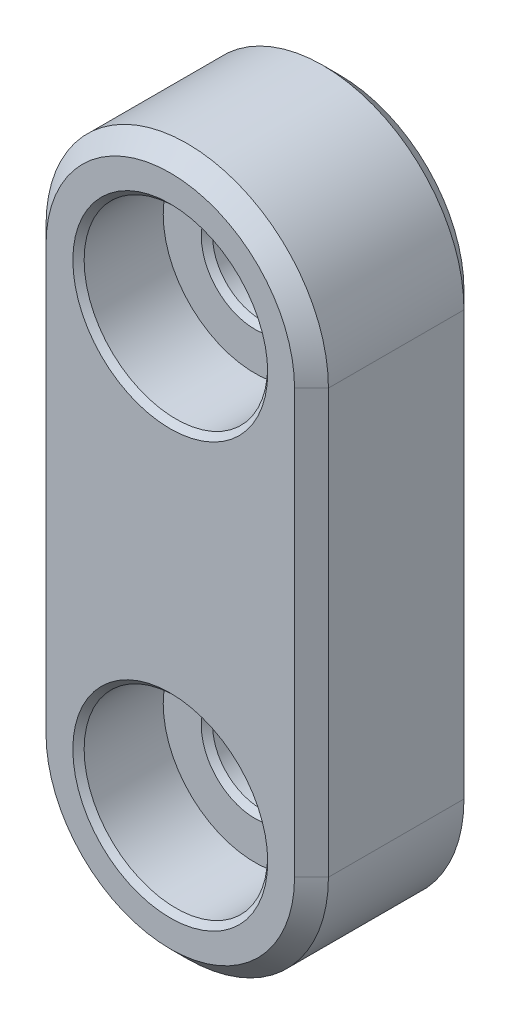
ISO-10303-21;
HEADER;
FILE_DESCRIPTION(('STEP AP214'),'2;1');
FILE_NAME('part.step','',(''),(''),'','','');
FILE_SCHEMA(('AUTOMOTIVE_DESIGN { 1 0 10303 214 1 1 1 1 }'));
ENDSEC;
DATA;
#1=APPLICATION_CONTEXT('core data for automotive mechanical design processes');
#2=APPLICATION_PROTOCOL_DEFINITION('international standard','automotive_design',2000,#1);
#3=PRODUCT_CONTEXT('',#1,'mechanical');
#4=PRODUCT('Part','Part','',(#3));
#5=PRODUCT_RELATED_PRODUCT_CATEGORY('part','',(#4));
#6=PRODUCT_DEFINITION_FORMATION('','',#4);
#7=PRODUCT_DEFINITION_CONTEXT('part definition',#1,'design');
#8=PRODUCT_DEFINITION('design','',#6,#7);
#9=PRODUCT_DEFINITION_SHAPE('','',#8);
#10=(LENGTH_UNIT() NAMED_UNIT(*) SI_UNIT(.MILLI.,.METRE.));
#11=(NAMED_UNIT(*) PLANE_ANGLE_UNIT() SI_UNIT($,.RADIAN.));
#12=(NAMED_UNIT(*) SI_UNIT($,.STERADIAN.) SOLID_ANGLE_UNIT());
#13=UNCERTAINTY_MEASURE_WITH_UNIT(LENGTH_MEASURE(1.E-05),#10,'distance_accuracy_value','');
#14=(GEOMETRIC_REPRESENTATION_CONTEXT(3) GLOBAL_UNCERTAINTY_ASSIGNED_CONTEXT((#13)) GLOBAL_UNIT_ASSIGNED_CONTEXT((#10,
#11,#12)) REPRESENTATION_CONTEXT('',''));
#15=CARTESIAN_POINT('',(0.,0.,0.));
#16=DIRECTION('',(0.,0.,1.));
#17=DIRECTION('',(1.,0.,0.));
#18=AXIS2_PLACEMENT_3D('',#15,#16,#17);
#19=CARTESIAN_POINT('',(0.,-7.5,6.));
#20=DIRECTION('',(0.,0.,-1.));
#21=DIRECTION('',(-1.,0.,0.));
#22=AXIS2_PLACEMENT_3D('',#19,#20,#21);
#23=CYLINDRICAL_SURFACE('',#22,5.);
#24=DIRECTION('',(0.,0.,-1.));
#25=VECTOR('',#24,1.);
#26=CARTESIAN_POINT('',(5.,-7.5,6.));
#27=LINE('',#26,#25);
#28=CARTESIAN_POINT('',(5.,-7.5,5.4));
#29=VERTEX_POINT('',#28);
#30=CARTESIAN_POINT('',(5.,-7.5,0.599999999999996));
#31=VERTEX_POINT('',#30);
#32=EDGE_CURVE('E128',#29,#31,#27,.T.);
#33=ORIENTED_EDGE('',*,*,#32,.F.);
#34=CARTESIAN_POINT('',(0.,-7.5,5.4));
#35=DIRECTION('',(0.,0.,1.));
#36=DIRECTION('',(1.,0.,0.));
#37=AXIS2_PLACEMENT_3D('',#34,#35,#36);
#38=CIRCLE('',#37,5.);
#39=CARTESIAN_POINT('',(-5.,-7.5,5.4));
#40=VERTEX_POINT('',#39);
#41=EDGE_CURVE('E220',#29,#40,#38,.F.);
#42=ORIENTED_EDGE('',*,*,#41,.T.);
#43=DIRECTION('',(0.,0.,-1.));
#44=VECTOR('',#43,1.);
#45=CARTESIAN_POINT('',(-5.,-7.5,6.));
#46=LINE('',#45,#44);
#47=CARTESIAN_POINT('',(-5.,-7.5,0.599999999999996));
#48=VERTEX_POINT('',#47);
#49=EDGE_CURVE('E134',#40,#48,#46,.T.);
#50=ORIENTED_EDGE('',*,*,#49,.T.);
#51=CARTESIAN_POINT('',(0.,-7.5,0.599999999999996));
#52=DIRECTION('',(0.,0.,1.));
#53=DIRECTION('',(1.,0.,0.));
#54=AXIS2_PLACEMENT_3D('',#51,#52,#53);
#55=CIRCLE('',#54,5.);
#56=EDGE_CURVE('E217',#48,#31,#55,.T.);
#57=ORIENTED_EDGE('',*,*,#56,.T.);
#58=EDGE_LOOP('',(#33,#42,#50,#57));
#59=FACE_BOUND('',#58,.T.);
#60=ADVANCED_FACE('F39',(#59),#23,.T.);
#61=CARTESIAN_POINT('',(5.,-7.5,6.));
#62=DIRECTION('',(-1.,0.,0.));
#63=DIRECTION('',(0.,-1.,0.));
#64=AXIS2_PLACEMENT_3D('',#61,#62,#63);
#65=PLANE('',#64);
#66=DIRECTION('',(0.,0.,-1.));
#67=VECTOR('',#66,1.);
#68=CARTESIAN_POINT('',(5.,7.5,6.));
#69=LINE('',#68,#67);
#70=CARTESIAN_POINT('',(5.,7.5,5.4));
#71=VERTEX_POINT('',#70);
#72=CARTESIAN_POINT('',(5.,7.5,0.599999999999996));
#73=VERTEX_POINT('',#72);
#74=EDGE_CURVE('E210',#71,#73,#69,.T.);
#75=ORIENTED_EDGE('',*,*,#74,.F.);
#76=DIRECTION('',(0.,-1.,0.));
#77=VECTOR('',#76,1.);
#78=CARTESIAN_POINT('',(5.,-7.5,5.4));
#79=LINE('',#78,#77);
#80=EDGE_CURVE('E131',#71,#29,#79,.T.);
#81=ORIENTED_EDGE('',*,*,#80,.T.);
#82=ORIENTED_EDGE('',*,*,#32,.T.);
#83=DIRECTION('',(0.,1.,0.));
#84=VECTOR('',#83,1.);
#85=CARTESIAN_POINT('',(5.,-7.5,0.599999999999996));
#86=LINE('',#85,#84);
#87=EDGE_CURVE('E223',#31,#73,#86,.T.);
#88=ORIENTED_EDGE('',*,*,#87,.T.);
#89=EDGE_LOOP('',(#75,#81,#82,#88));
#90=FACE_BOUND('',#89,.T.);
#91=ADVANCED_FACE('F259',(#90),#65,.F.);
#92=CARTESIAN_POINT('',(0.,7.5,6.));
#93=DIRECTION('',(0.,0.,-1.));
#94=DIRECTION('',(-1.,0.,0.));
#95=AXIS2_PLACEMENT_3D('',#92,#93,#94);
#96=CYLINDRICAL_SURFACE('',#95,5.);
#97=DIRECTION('',(0.,0.,-1.));
#98=VECTOR('',#97,1.);
#99=CARTESIAN_POINT('',(-5.,7.5,6.));
#100=LINE('',#99,#98);
#101=CARTESIAN_POINT('',(-5.,7.5,5.4));
#102=VERTEX_POINT('',#101);
#103=CARTESIAN_POINT('',(-5.,7.5,0.599999999999996));
#104=VERTEX_POINT('',#103);
#105=EDGE_CURVE('E207',#102,#104,#100,.T.);
#106=ORIENTED_EDGE('',*,*,#105,.F.);
#107=CARTESIAN_POINT('',(0.,7.5,5.4));
#108=DIRECTION('',(0.,0.,1.));
#109=DIRECTION('',(1.,0.,0.));
#110=AXIS2_PLACEMENT_3D('',#107,#108,#109);
#111=CIRCLE('',#110,5.);
#112=EDGE_CURVE('E232',#102,#71,#111,.F.);
#113=ORIENTED_EDGE('',*,*,#112,.T.);
#114=ORIENTED_EDGE('',*,*,#74,.T.);
#115=CARTESIAN_POINT('',(0.,7.5,0.599999999999996));
#116=DIRECTION('',(0.,0.,1.));
#117=DIRECTION('',(1.,0.,0.));
#118=AXIS2_PLACEMENT_3D('',#115,#116,#117);
#119=CIRCLE('',#118,5.);
#120=EDGE_CURVE('E230',#73,#104,#119,.T.);
#121=ORIENTED_EDGE('',*,*,#120,.T.);
#122=EDGE_LOOP('',(#106,#113,#114,#121));
#123=FACE_BOUND('',#122,.T.);
#124=ADVANCED_FACE('F262',(#123),#96,.T.);
#125=CARTESIAN_POINT('',(-5.,-7.5,6.));
#126=DIRECTION('',(1.,0.,0.));
#127=DIRECTION('',(0.,1.,0.));
#128=AXIS2_PLACEMENT_3D('',#125,#126,#127);
#129=PLANE('',#128);
#130=ORIENTED_EDGE('',*,*,#49,.F.);
#131=DIRECTION('',(0.,1.,0.));
#132=VECTOR('',#131,1.);
#133=CARTESIAN_POINT('',(-5.,7.5,5.4));
#134=LINE('',#133,#132);
#135=EDGE_CURVE('E228',#40,#102,#134,.T.);
#136=ORIENTED_EDGE('',*,*,#135,.T.);
#137=ORIENTED_EDGE('',*,*,#105,.T.);
#138=DIRECTION('',(0.,-1.,0.));
#139=VECTOR('',#138,1.);
#140=CARTESIAN_POINT('',(-5.,-7.5,0.599999999999996));
#141=LINE('',#140,#139);
#142=EDGE_CURVE('E226',#104,#48,#141,.T.);
#143=ORIENTED_EDGE('',*,*,#142,.T.);
#144=EDGE_LOOP('',(#130,#136,#137,#143));
#145=FACE_BOUND('',#144,.T.);
#146=ADVANCED_FACE('F248',(#145),#129,.F.);
#147=CARTESIAN_POINT('',(0.,-7.5,6.));
#148=DIRECTION('',(0.,0.,1.));
#149=DIRECTION('',(1.,0.,0.));
#150=AXIS2_PLACEMENT_3D('',#147,#148,#149);
#151=PLANE('',#150);
#152=CARTESIAN_POINT('',(0.,7.5,6.));
#153=DIRECTION('',(0.,0.,1.));
#154=DIRECTION('',(1.,0.,0.));
#155=AXIS2_PLACEMENT_3D('',#152,#153,#154);
#156=CIRCLE('',#155,3.44999999999999);
#157=CARTESIAN_POINT('',(3.44999999999999,7.5,6.));
#158=VERTEX_POINT('',#157);
#159=EDGE_CURVE('E48',#158,#158,#156,.F.);
#160=ORIENTED_EDGE('',*,*,#159,.T.);
#161=EDGE_LOOP('',(#160));
#162=FACE_BOUND('',#161,.T.);
#163=CARTESIAN_POINT('',(0.,-7.5,6.));
#164=DIRECTION('',(0.,0.,1.));
#165=DIRECTION('',(1.,0.,0.));
#166=AXIS2_PLACEMENT_3D('',#163,#164,#165);
#167=CIRCLE('',#166,3.44999999999999);
#168=CARTESIAN_POINT('',(3.44999999999999,-7.5,6.));
#169=VERTEX_POINT('',#168);
#170=EDGE_CURVE('E178',#169,#169,#167,.F.);
#171=ORIENTED_EDGE('',*,*,#170,.T.);
#172=EDGE_LOOP('',(#171));
#173=FACE_BOUND('',#172,.T.);
#174=DIRECTION('',(0.,-1.,0.));
#175=VECTOR('',#174,1.);
#176=CARTESIAN_POINT('',(-4.4,-7.5,6.));
#177=LINE('',#176,#175);
#178=CARTESIAN_POINT('',(-4.40000000000001,7.5,6.));
#179=VERTEX_POINT('',#178);
#180=CARTESIAN_POINT('',(-4.4,-7.5,6.));
#181=VERTEX_POINT('',#180);
#182=EDGE_CURVE('E117',#179,#181,#177,.T.);
#183=ORIENTED_EDGE('',*,*,#182,.T.);
#184=CARTESIAN_POINT('',(0.,-7.5,6.));
#185=DIRECTION('',(0.,0.,1.));
#186=DIRECTION('',(1.,0.,0.));
#187=AXIS2_PLACEMENT_3D('',#184,#185,#186);
#188=CIRCLE('',#187,4.4);
#189=CARTESIAN_POINT('',(4.4,-7.5,6.));
#190=VERTEX_POINT('',#189);
#191=EDGE_CURVE('E113',#181,#190,#188,.T.);
#192=ORIENTED_EDGE('',*,*,#191,.T.);
#193=DIRECTION('',(0.,1.,0.));
#194=VECTOR('',#193,1.);
#195=CARTESIAN_POINT('',(4.4,7.5,6.));
#196=LINE('',#195,#194);
#197=CARTESIAN_POINT('',(4.4,7.5,6.));
#198=VERTEX_POINT('',#197);
#199=EDGE_CURVE('E107',#190,#198,#196,.T.);
#200=ORIENTED_EDGE('',*,*,#199,.T.);
#201=CARTESIAN_POINT('',(0.,7.5,6.));
#202=DIRECTION('',(0.,0.,1.));
#203=DIRECTION('',(1.,0.,0.));
#204=AXIS2_PLACEMENT_3D('',#201,#202,#203);
#205=CIRCLE('',#204,4.4);
#206=EDGE_CURVE('E110',#198,#179,#205,.T.);
#207=ORIENTED_EDGE('',*,*,#206,.T.);
#208=EDGE_LOOP('',(#183,#192,#200,#207));
#209=FACE_BOUND('',#208,.T.);
#210=ADVANCED_FACE('F109',(#162,#173,#209),#151,.T.);
#211=CARTESIAN_POINT('',(0.,-7.5,0.));
#212=DIRECTION('',(0.,0.,1.));
#213=DIRECTION('',(1.,0.,0.));
#214=AXIS2_PLACEMENT_3D('',#211,#212,#213);
#215=PLANE('',#214);
#216=CARTESIAN_POINT('',(0.,-7.5,0.));
#217=DIRECTION('',(0.,0.,1.));
#218=DIRECTION('',(1.,0.,0.));
#219=AXIS2_PLACEMENT_3D('',#216,#217,#218);
#220=CIRCLE('',#219,1.9);
#221=CARTESIAN_POINT('',(1.9,-7.5,0.));
#222=VERTEX_POINT('',#221);
#223=EDGE_CURVE('E163',#222,#222,#220,.T.);
#224=ORIENTED_EDGE('',*,*,#223,.T.);
#225=EDGE_LOOP('',(#224));
#226=FACE_BOUND('',#225,.T.);
#227=CARTESIAN_POINT('',(0.,7.5,0.));
#228=DIRECTION('',(0.,0.,1.));
#229=DIRECTION('',(1.,0.,0.));
#230=AXIS2_PLACEMENT_3D('',#227,#228,#229);
#231=CIRCLE('',#230,1.9);
#232=CARTESIAN_POINT('',(1.89999999999999,7.5,0.));
#233=VERTEX_POINT('',#232);
#234=EDGE_CURVE('E160',#233,#233,#231,.T.);
#235=ORIENTED_EDGE('',*,*,#234,.T.);
#236=EDGE_LOOP('',(#235));
#237=FACE_BOUND('',#236,.T.);
#238=DIRECTION('',(0.,-1.,0.));
#239=VECTOR('',#238,1.);
#240=CARTESIAN_POINT('',(4.4,-7.5,0.));
#241=LINE('',#240,#239);
#242=CARTESIAN_POINT('',(4.4,7.5,0.));
#243=VERTEX_POINT('',#242);
#244=CARTESIAN_POINT('',(4.4,-7.5,0.));
#245=VERTEX_POINT('',#244);
#246=EDGE_CURVE('E55',#243,#245,#241,.T.);
#247=ORIENTED_EDGE('',*,*,#246,.T.);
#248=CARTESIAN_POINT('',(0.,-7.5,0.));
#249=DIRECTION('',(0.,0.,1.));
#250=DIRECTION('',(1.,0.,0.));
#251=AXIS2_PLACEMENT_3D('',#248,#249,#250);
#252=CIRCLE('',#251,4.4);
#253=CARTESIAN_POINT('',(-4.4,-7.5,0.));
#254=VERTEX_POINT('',#253);
#255=EDGE_CURVE('E154',#245,#254,#252,.F.);
#256=ORIENTED_EDGE('',*,*,#255,.T.);
#257=DIRECTION('',(0.,1.,0.));
#258=VECTOR('',#257,1.);
#259=CARTESIAN_POINT('',(-4.4,-7.5,0.));
#260=LINE('',#259,#258);
#261=CARTESIAN_POINT('',(-4.4,7.5,0.));
#262=VERTEX_POINT('',#261);
#263=EDGE_CURVE('E236',#254,#262,#260,.T.);
#264=ORIENTED_EDGE('',*,*,#263,.T.);
#265=CARTESIAN_POINT('',(0.,7.5,0.));
#266=DIRECTION('',(0.,0.,1.));
#267=DIRECTION('',(1.,0.,0.));
#268=AXIS2_PLACEMENT_3D('',#265,#266,#267);
#269=CIRCLE('',#268,4.4);
#270=EDGE_CURVE('E234',#262,#243,#269,.F.);
#271=ORIENTED_EDGE('',*,*,#270,.T.);
#272=EDGE_LOOP('',(#247,#256,#264,#271));
#273=FACE_BOUND('',#272,.T.);
#274=ADVANCED_FACE('F309',(#226,#237,#273),#215,.F.);
#275=CARTESIAN_POINT('',(0.,7.5,6.));
#276=DIRECTION('',(0.,0.,-1.));
#277=DIRECTION('',(-1.,0.,0.));
#278=AXIS2_PLACEMENT_3D('',#275,#276,#277);
#279=CONICAL_SURFACE('',#278,4.4,0.785398163397449);
#280=DIRECTION('',(-0.707106781186548,0.,0.707106781186547));
#281=VECTOR('',#280,1.);
#282=CARTESIAN_POINT('',(5.,7.5,5.4));
#283=LINE('',#282,#281);
#284=EDGE_CURVE('E123',#71,#198,#283,.T.);
#285=ORIENTED_EDGE('',*,*,#284,.F.);
#286=ORIENTED_EDGE('',*,*,#112,.F.);
#287=DIRECTION('',(-0.707106781186548,0.,-0.707106781186547));
#288=VECTOR('',#287,1.);
#289=CARTESIAN_POINT('',(-4.40000000000001,7.5,6.));
#290=LINE('',#289,#288);
#291=EDGE_CURVE('E126',#179,#102,#290,.T.);
#292=ORIENTED_EDGE('',*,*,#291,.F.);
#293=ORIENTED_EDGE('',*,*,#206,.F.);
#294=EDGE_LOOP('',(#285,#286,#292,#293));
#295=FACE_BOUND('',#294,.T.);
#296=ADVANCED_FACE('F121',(#295),#279,.T.);
#297=CARTESIAN_POINT('',(-4.4,-7.5,6.));
#298=DIRECTION('',(-0.707106781186547,0.,0.707106781186548));
#299=DIRECTION('',(0.,1.,0.));
#300=AXIS2_PLACEMENT_3D('',#297,#298,#299);
#301=PLANE('',#300);
#302=ORIENTED_EDGE('',*,*,#291,.T.);
#303=ORIENTED_EDGE('',*,*,#135,.F.);
#304=DIRECTION('',(-0.707106781186548,0.,-0.707106781186547));
#305=VECTOR('',#304,1.);
#306=CARTESIAN_POINT('',(-4.4,-7.5,6.));
#307=LINE('',#306,#305);
#308=EDGE_CURVE('E132',#181,#40,#307,.T.);
#309=ORIENTED_EDGE('',*,*,#308,.F.);
#310=ORIENTED_EDGE('',*,*,#182,.F.);
#311=EDGE_LOOP('',(#302,#303,#309,#310));
#312=FACE_BOUND('',#311,.T.);
#313=ADVANCED_FACE('F299',(#312),#301,.T.);
#314=CARTESIAN_POINT('',(4.4,-7.5,6.));
#315=DIRECTION('',(0.707106781186547,0.,0.707106781186548));
#316=DIRECTION('',(0.,-1.,0.));
#317=AXIS2_PLACEMENT_3D('',#314,#315,#316);
#318=PLANE('',#317);
#319=ORIENTED_EDGE('',*,*,#284,.T.);
#320=ORIENTED_EDGE('',*,*,#199,.F.);
#321=DIRECTION('',(-0.707106781186548,0.,0.707106781186547));
#322=VECTOR('',#321,1.);
#323=CARTESIAN_POINT('',(5.,-7.5,5.4));
#324=LINE('',#323,#322);
#325=EDGE_CURVE('E136',#29,#190,#324,.T.);
#326=ORIENTED_EDGE('',*,*,#325,.F.);
#327=ORIENTED_EDGE('',*,*,#80,.F.);
#328=EDGE_LOOP('',(#319,#320,#326,#327));
#329=FACE_BOUND('',#328,.T.);
#330=ADVANCED_FACE('F130',(#329),#318,.T.);
#331=CARTESIAN_POINT('',(0.,-7.5,6.));
#332=DIRECTION('',(0.,0.,-1.));
#333=DIRECTION('',(-1.,0.,0.));
#334=AXIS2_PLACEMENT_3D('',#331,#332,#333);
#335=CONICAL_SURFACE('',#334,4.4,0.785398163397449);
#336=ORIENTED_EDGE('',*,*,#308,.T.);
#337=ORIENTED_EDGE('',*,*,#41,.F.);
#338=ORIENTED_EDGE('',*,*,#325,.T.);
#339=ORIENTED_EDGE('',*,*,#191,.F.);
#340=EDGE_LOOP('',(#336,#337,#338,#339));
#341=FACE_BOUND('',#340,.T.);
#342=ADVANCED_FACE('F241',(#341),#335,.T.);
#343=CARTESIAN_POINT('',(0.,7.5,0.599999999999996));
#344=DIRECTION('',(0.,0.,1.));
#345=DIRECTION('',(1.,0.,0.));
#346=AXIS2_PLACEMENT_3D('',#343,#344,#345);
#347=CONICAL_SURFACE('',#346,5.,0.785398163397452);
#348=DIRECTION('',(0.70710678118655,0.,0.707106781186545));
#349=VECTOR('',#348,1.);
#350=CARTESIAN_POINT('',(4.4,7.5,0.));
#351=LINE('',#350,#349);
#352=EDGE_CURVE('E144',#243,#73,#351,.T.);
#353=ORIENTED_EDGE('',*,*,#352,.F.);
#354=ORIENTED_EDGE('',*,*,#270,.F.);
#355=DIRECTION('',(0.70710678118655,0.,-0.707106781186545));
#356=VECTOR('',#355,1.);
#357=CARTESIAN_POINT('',(-5.,7.5,0.599999999999996));
#358=LINE('',#357,#356);
#359=EDGE_CURVE('E147',#104,#262,#358,.T.);
#360=ORIENTED_EDGE('',*,*,#359,.F.);
#361=ORIENTED_EDGE('',*,*,#120,.F.);
#362=EDGE_LOOP('',(#353,#354,#360,#361));
#363=FACE_BOUND('',#362,.T.);
#364=ADVANCED_FACE('F265',(#363),#347,.T.);
#365=CARTESIAN_POINT('',(-5.,-7.5,0.599999999999996));
#366=DIRECTION('',(0.707106781186545,0.,0.70710678118655));
#367=DIRECTION('',(0.,-1.,0.));
#368=AXIS2_PLACEMENT_3D('',#365,#366,#367);
#369=PLANE('',#368);
#370=ORIENTED_EDGE('',*,*,#359,.T.);
#371=ORIENTED_EDGE('',*,*,#263,.F.);
#372=DIRECTION('',(0.70710678118655,0.,-0.707106781186545));
#373=VECTOR('',#372,1.);
#374=CARTESIAN_POINT('',(-5.,-7.5,0.599999999999996));
#375=LINE('',#374,#373);
#376=EDGE_CURVE('E62',#48,#254,#375,.T.);
#377=ORIENTED_EDGE('',*,*,#376,.F.);
#378=ORIENTED_EDGE('',*,*,#142,.F.);
#379=EDGE_LOOP('',(#370,#371,#377,#378));
#380=FACE_BOUND('',#379,.T.);
#381=ADVANCED_FACE('F253',(#380),#369,.F.);
#382=CARTESIAN_POINT('',(5.,-7.5,0.599999999999996));
#383=DIRECTION('',(-0.707106781186545,0.,0.70710678118655));
#384=DIRECTION('',(0.,1.,0.));
#385=AXIS2_PLACEMENT_3D('',#382,#383,#384);
#386=PLANE('',#385);
#387=ORIENTED_EDGE('',*,*,#352,.T.);
#388=ORIENTED_EDGE('',*,*,#87,.F.);
#389=DIRECTION('',(0.70710678118655,0.,0.707106781186545));
#390=VECTOR('',#389,1.);
#391=CARTESIAN_POINT('',(4.4,-7.5,0.));
#392=LINE('',#391,#390);
#393=EDGE_CURVE('E140',#245,#31,#392,.T.);
#394=ORIENTED_EDGE('',*,*,#393,.F.);
#395=ORIENTED_EDGE('',*,*,#246,.F.);
#396=EDGE_LOOP('',(#387,#388,#394,#395));
#397=FACE_BOUND('',#396,.T.);
#398=ADVANCED_FACE('F268',(#397),#386,.F.);
#399=CARTESIAN_POINT('',(0.,-7.5,0.599999999999996));
#400=DIRECTION('',(0.,0.,1.));
#401=DIRECTION('',(1.,0.,0.));
#402=AXIS2_PLACEMENT_3D('',#399,#400,#401);
#403=CONICAL_SURFACE('',#402,5.,0.785398163397452);
#404=ORIENTED_EDGE('',*,*,#376,.T.);
#405=ORIENTED_EDGE('',*,*,#255,.F.);
#406=ORIENTED_EDGE('',*,*,#393,.T.);
#407=ORIENTED_EDGE('',*,*,#56,.F.);
#408=EDGE_LOOP('',(#404,#405,#406,#407));
#409=FACE_BOUND('',#408,.T.);
#410=ADVANCED_FACE('F254',(#409),#403,.T.);
#411=CARTESIAN_POINT('',(0.,-7.5,6.));
#412=DIRECTION('',(0.,0.,1.));
#413=DIRECTION('',(1.,0.,0.));
#414=AXIS2_PLACEMENT_3D('',#411,#412,#413);
#415=CYLINDRICAL_SURFACE('',#414,1.7);
#416=CARTESIAN_POINT('',(0.,-7.5,2.8));
#417=DIRECTION('',(0.,0.,-1.));
#418=DIRECTION('',(-1.,0.,0.));
#419=AXIS2_PLACEMENT_3D('',#416,#417,#418);
#420=CIRCLE('',#419,1.7);
#421=CARTESIAN_POINT('',(-1.7,-7.5,2.8));
#422=VERTEX_POINT('',#421);
#423=EDGE_CURVE('E153',#422,#422,#420,.F.);
#424=ORIENTED_EDGE('',*,*,#423,.T.);
#425=EDGE_LOOP('',(#424));
#426=FACE_BOUND('',#425,.T.);
#427=CARTESIAN_POINT('',(0.,-7.5,0.199999999999997));
#428=DIRECTION('',(0.,0.,1.));
#429=DIRECTION('',(1.,0.,0.));
#430=AXIS2_PLACEMENT_3D('',#427,#428,#429);
#431=CIRCLE('',#430,1.7);
#432=CARTESIAN_POINT('',(1.7,-7.5,0.199999999999997));
#433=VERTEX_POINT('',#432);
#434=EDGE_CURVE('E150',#433,#433,#431,.F.);
#435=ORIENTED_EDGE('',*,*,#434,.T.);
#436=EDGE_LOOP('',(#435));
#437=FACE_BOUND('',#436,.T.);
#438=ADVANCED_FACE('F275',(#426,#437),#415,.F.);
#439=CARTESIAN_POINT('',(1.7,-7.5,3.));
#440=DIRECTION('',(0.,0.,-1.));
#441=DIRECTION('',(-1.,0.,0.));
#442=AXIS2_PLACEMENT_3D('',#439,#440,#441);
#443=PLANE('',#442);
#444=CARTESIAN_POINT('',(0.,-7.5,3.));
#445=DIRECTION('',(0.,0.,-1.));
#446=DIRECTION('',(-1.,0.,0.));
#447=AXIS2_PLACEMENT_3D('',#444,#445,#446);
#448=CIRCLE('',#447,1.9);
#449=CARTESIAN_POINT('',(-1.9,-7.5,3.));
#450=VERTEX_POINT('',#449);
#451=EDGE_CURVE('E157',#450,#450,#448,.T.);
#452=ORIENTED_EDGE('',*,*,#451,.T.);
#453=EDGE_LOOP('',(#452));
#454=FACE_BOUND('',#453,.T.);
#455=CARTESIAN_POINT('',(0.,-7.5,3.));
#456=DIRECTION('',(0.,0.,1.));
#457=DIRECTION('',(1.,0.,0.));
#458=AXIS2_PLACEMENT_3D('',#455,#456,#457);
#459=CIRCLE('',#458,3.25);
#460=CARTESIAN_POINT('',(3.25,-7.5,3.));
#461=VERTEX_POINT('',#460);
#462=EDGE_CURVE('E142',#461,#461,#459,.T.);
#463=ORIENTED_EDGE('',*,*,#462,.T.);
#464=EDGE_LOOP('',(#463));
#465=FACE_BOUND('',#464,.T.);
#466=ADVANCED_FACE('F428',(#454,#465),#443,.F.);
#467=CARTESIAN_POINT('',(0.,-7.5,6.));
#468=DIRECTION('',(0.,0.,1.));
#469=DIRECTION('',(1.,0.,0.));
#470=AXIS2_PLACEMENT_3D('',#467,#468,#469);
#471=CYLINDRICAL_SURFACE('',#470,3.25);
#472=CARTESIAN_POINT('',(0.,-7.5,5.8));
#473=DIRECTION('',(0.,0.,1.));
#474=DIRECTION('',(1.,0.,0.));
#475=AXIS2_PLACEMENT_3D('',#472,#473,#474);
#476=CIRCLE('',#475,3.25);
#477=CARTESIAN_POINT('',(3.25,-7.5,5.8));
#478=VERTEX_POINT('',#477);
#479=EDGE_CURVE('E11',#478,#478,#476,.T.);
#480=ORIENTED_EDGE('',*,*,#479,.T.);
#481=EDGE_LOOP('',(#480));
#482=FACE_BOUND('',#481,.T.);
#483=ORIENTED_EDGE('',*,*,#462,.F.);
#484=EDGE_LOOP('',(#483));
#485=FACE_BOUND('',#484,.T.);
#486=ADVANCED_FACE('F438',(#482,#485),#471,.F.);
#487=CARTESIAN_POINT('',(0.,7.5,6.));
#488=DIRECTION('',(0.,0.,1.));
#489=DIRECTION('',(1.,0.,0.));
#490=AXIS2_PLACEMENT_3D('',#487,#488,#489);
#491=CYLINDRICAL_SURFACE('',#490,1.7);
#492=CARTESIAN_POINT('',(0.,7.5,2.8));
#493=DIRECTION('',(0.,0.,-1.));
#494=DIRECTION('',(-1.,0.,0.));
#495=AXIS2_PLACEMENT_3D('',#492,#493,#494);
#496=CIRCLE('',#495,1.7);
#497=CARTESIAN_POINT('',(-1.7,7.5,2.8));
#498=VERTEX_POINT('',#497);
#499=EDGE_CURVE('E169',#498,#498,#496,.F.);
#500=ORIENTED_EDGE('',*,*,#499,.T.);
#501=EDGE_LOOP('',(#500));
#502=FACE_BOUND('',#501,.T.);
#503=CARTESIAN_POINT('',(0.,7.5,0.199999999999997));
#504=DIRECTION('',(0.,0.,1.));
#505=DIRECTION('',(1.,0.,0.));
#506=AXIS2_PLACEMENT_3D('',#503,#504,#505);
#507=CIRCLE('',#506,1.7);
#508=CARTESIAN_POINT('',(1.7,7.5,0.199999999999997));
#509=VERTEX_POINT('',#508);
#510=EDGE_CURVE('E166',#509,#509,#507,.F.);
#511=ORIENTED_EDGE('',*,*,#510,.T.);
#512=EDGE_LOOP('',(#511));
#513=FACE_BOUND('',#512,.T.);
#514=ADVANCED_FACE('F449',(#502,#513),#491,.F.);
#515=CARTESIAN_POINT('',(1.7,7.5,3.));
#516=DIRECTION('',(0.,0.,-1.));
#517=DIRECTION('',(-1.,0.,0.));
#518=AXIS2_PLACEMENT_3D('',#515,#516,#517);
#519=PLANE('',#518);
#520=CARTESIAN_POINT('',(0.,7.5,3.));
#521=DIRECTION('',(0.,0.,-1.));
#522=DIRECTION('',(-1.,0.,0.));
#523=AXIS2_PLACEMENT_3D('',#520,#521,#522);
#524=CIRCLE('',#523,1.9);
#525=CARTESIAN_POINT('',(-1.90000000000001,7.5,3.));
#526=VERTEX_POINT('',#525);
#527=EDGE_CURVE('E172',#526,#526,#524,.T.);
#528=ORIENTED_EDGE('',*,*,#527,.T.);
#529=EDGE_LOOP('',(#528));
#530=FACE_BOUND('',#529,.T.);
#531=CARTESIAN_POINT('',(0.,7.5,3.));
#532=DIRECTION('',(0.,0.,1.));
#533=DIRECTION('',(1.,0.,0.));
#534=AXIS2_PLACEMENT_3D('',#531,#532,#533);
#535=CIRCLE('',#534,3.25);
#536=CARTESIAN_POINT('',(3.24999999999999,7.5,3.));
#537=VERTEX_POINT('',#536);
#538=EDGE_CURVE('E199',#537,#537,#535,.T.);
#539=ORIENTED_EDGE('',*,*,#538,.T.);
#540=EDGE_LOOP('',(#539));
#541=FACE_BOUND('',#540,.T.);
#542=ADVANCED_FACE('F195',(#530,#541),#519,.F.);
#543=CARTESIAN_POINT('',(0.,7.5,6.));
#544=DIRECTION('',(0.,0.,1.));
#545=DIRECTION('',(1.,0.,0.));
#546=AXIS2_PLACEMENT_3D('',#543,#544,#545);
#547=CYLINDRICAL_SURFACE('',#546,3.25);
#548=CARTESIAN_POINT('',(0.,7.5,5.8));
#549=DIRECTION('',(0.,0.,1.));
#550=DIRECTION('',(1.,0.,0.));
#551=AXIS2_PLACEMENT_3D('',#548,#549,#550);
#552=CIRCLE('',#551,3.25);
#553=CARTESIAN_POINT('',(3.24999999999999,7.5,5.8));
#554=VERTEX_POINT('',#553);
#555=EDGE_CURVE('E175',#554,#554,#552,.T.);
#556=ORIENTED_EDGE('',*,*,#555,.T.);
#557=EDGE_LOOP('',(#556));
#558=FACE_BOUND('',#557,.T.);
#559=ORIENTED_EDGE('',*,*,#538,.F.);
#560=EDGE_LOOP('',(#559));
#561=FACE_BOUND('',#560,.T.);
#562=ADVANCED_FACE('F191',(#558,#561),#547,.F.);
#563=CARTESIAN_POINT('',(0.,-7.5,2.8));
#564=DIRECTION('',(0.,0.,1.));
#565=DIRECTION('',(1.,0.,0.));
#566=AXIS2_PLACEMENT_3D('',#563,#564,#565);
#567=CONICAL_SURFACE('',#566,1.7,0.785398163397451);
#568=ORIENTED_EDGE('',*,*,#451,.F.);
#569=EDGE_LOOP('',(#568));
#570=FACE_BOUND('',#569,.T.);
#571=ORIENTED_EDGE('',*,*,#423,.F.);
#572=EDGE_LOOP('',(#571));
#573=FACE_BOUND('',#572,.T.);
#574=ADVANCED_FACE('F194',(#570,#573),#567,.F.);
#575=CARTESIAN_POINT('',(0.,-7.5,0.));
#576=DIRECTION('',(0.,0.,-1.));
#577=DIRECTION('',(-1.,0.,0.));
#578=AXIS2_PLACEMENT_3D('',#575,#576,#577);
#579=CONICAL_SURFACE('',#578,1.9,0.785398163397446);
#580=ORIENTED_EDGE('',*,*,#434,.F.);
#581=EDGE_LOOP('',(#580));
#582=FACE_BOUND('',#581,.T.);
#583=ORIENTED_EDGE('',*,*,#223,.F.);
#584=EDGE_LOOP('',(#583));
#585=FACE_BOUND('',#584,.T.);
#586=ADVANCED_FACE('F326',(#582,#585),#579,.F.);
#587=CARTESIAN_POINT('',(0.,7.5,2.8));
#588=DIRECTION('',(0.,0.,1.));
#589=DIRECTION('',(1.,0.,0.));
#590=AXIS2_PLACEMENT_3D('',#587,#588,#589);
#591=CONICAL_SURFACE('',#590,1.7,0.785398163397451);
#592=ORIENTED_EDGE('',*,*,#527,.F.);
#593=EDGE_LOOP('',(#592));
#594=FACE_BOUND('',#593,.T.);
#595=ORIENTED_EDGE('',*,*,#499,.F.);
#596=EDGE_LOOP('',(#595));
#597=FACE_BOUND('',#596,.T.);
#598=ADVANCED_FACE('F331',(#594,#597),#591,.F.);
#599=CARTESIAN_POINT('',(0.,7.5,0.));
#600=DIRECTION('',(0.,0.,-1.));
#601=DIRECTION('',(-1.,0.,0.));
#602=AXIS2_PLACEMENT_3D('',#599,#600,#601);
#603=CONICAL_SURFACE('',#602,1.9,0.785398163397446);
#604=ORIENTED_EDGE('',*,*,#510,.F.);
#605=EDGE_LOOP('',(#604));
#606=FACE_BOUND('',#605,.T.);
#607=ORIENTED_EDGE('',*,*,#234,.F.);
#608=EDGE_LOOP('',(#607));
#609=FACE_BOUND('',#608,.T.);
#610=ADVANCED_FACE('F188',(#606,#609),#603,.F.);
#611=CARTESIAN_POINT('',(0.,7.5,5.8));
#612=DIRECTION('',(0.,0.,1.));
#613=DIRECTION('',(1.,0.,0.));
#614=AXIS2_PLACEMENT_3D('',#611,#612,#613);
#615=CONICAL_SURFACE('',#614,3.25,0.785398163397448);
#616=ORIENTED_EDGE('',*,*,#159,.F.);
#617=EDGE_LOOP('',(#616));
#618=FACE_BOUND('',#617,.T.);
#619=ORIENTED_EDGE('',*,*,#555,.F.);
#620=EDGE_LOOP('',(#619));
#621=FACE_BOUND('',#620,.T.);
#622=ADVANCED_FACE('F185',(#618,#621),#615,.F.);
#623=CARTESIAN_POINT('',(0.,-7.5,5.8));
#624=DIRECTION('',(0.,0.,1.));
#625=DIRECTION('',(1.,0.,0.));
#626=AXIS2_PLACEMENT_3D('',#623,#624,#625);
#627=CONICAL_SURFACE('',#626,3.25,0.785398163397448);
#628=ORIENTED_EDGE('',*,*,#170,.F.);
#629=EDGE_LOOP('',(#628));
#630=FACE_BOUND('',#629,.T.);
#631=ORIENTED_EDGE('',*,*,#479,.F.);
#632=EDGE_LOOP('',(#631));
#633=FACE_BOUND('',#632,.T.);
#634=ADVANCED_FACE('F42',(#630,#633),#627,.F.);
#635=CLOSED_SHELL('',(#60,#91,#124,#146,#210,#274,#296,#313,#330,#342,#364,#381,#398,#410,#438,
#466,#486,#514,#542,#562,#574,#586,#598,#610,#622,#634));
#636=MANIFOLD_SOLID_BREP('B2',#635);
#637=ADVANCED_BREP_SHAPE_REPRESENTATION('',(#18,#636),#14);
#638=SHAPE_DEFINITION_REPRESENTATION(#9,#637);
ENDSEC;
END-ISO-10303-21;
